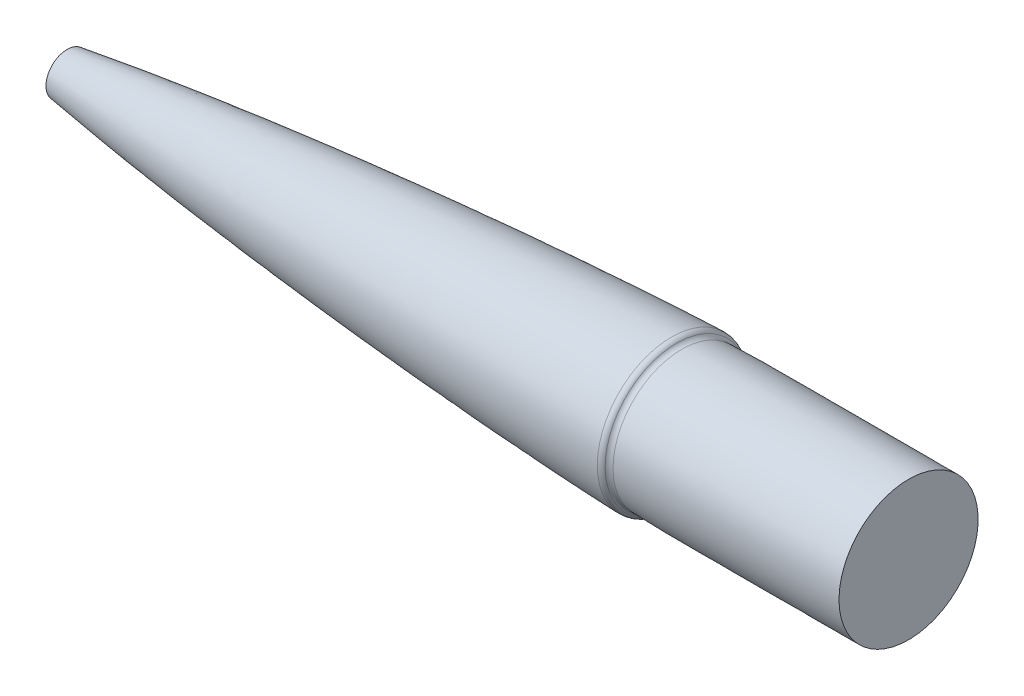
ISO-10303-21;
HEADER;
FILE_DESCRIPTION(('STEP AP214'),'2;1');
FILE_NAME('part.step','',(''),(''),'','','');
FILE_SCHEMA(('AUTOMOTIVE_DESIGN { 1 0 10303 214 1 1 1 1 }'));
ENDSEC;
DATA;
#1=APPLICATION_CONTEXT('core data for automotive mechanical design processes');
#2=APPLICATION_PROTOCOL_DEFINITION('international standard','automotive_design',2000,#1);
#3=PRODUCT_CONTEXT('',#1,'mechanical');
#4=PRODUCT('Part','Part','',(#3));
#5=PRODUCT_RELATED_PRODUCT_CATEGORY('part','',(#4));
#6=PRODUCT_DEFINITION_FORMATION('','',#4);
#7=PRODUCT_DEFINITION_CONTEXT('part definition',#1,'design');
#8=PRODUCT_DEFINITION('design','',#6,#7);
#9=PRODUCT_DEFINITION_SHAPE('','',#8);
#10=(LENGTH_UNIT() NAMED_UNIT(*) SI_UNIT(.MILLI.,.METRE.));
#11=(NAMED_UNIT(*) PLANE_ANGLE_UNIT() SI_UNIT($,.RADIAN.));
#12=(NAMED_UNIT(*) SI_UNIT($,.STERADIAN.) SOLID_ANGLE_UNIT());
#13=UNCERTAINTY_MEASURE_WITH_UNIT(LENGTH_MEASURE(1.E-05),#10,'distance_accuracy_value','');
#14=(GEOMETRIC_REPRESENTATION_CONTEXT(3) GLOBAL_UNCERTAINTY_ASSIGNED_CONTEXT((#13)) GLOBAL_UNIT_ASSIGNED_CONTEXT((#10,
#11,#12)) REPRESENTATION_CONTEXT('',''));
#15=CARTESIAN_POINT('',(0.,0.,0.));
#16=DIRECTION('',(0.,0.,1.));
#17=DIRECTION('',(1.,0.,0.));
#18=AXIS2_PLACEMENT_3D('',#15,#16,#17);
#19=CARTESIAN_POINT('',(4.83268455642582,0.,6.60552318193741));
#20=CARTESIAN_POINT('',(4.83749972097028,0.,6.60285947370063));
#21=CARTESIAN_POINT('',(4.82681383787675,0.,6.60876016188589));
#22=CARTESIAN_POINT('',(4.83801886693308,0.,6.60257668329158));
#23=CARTESIAN_POINT('',(4.83250618312896,0.,6.60561165797518));
#24=CARTESIAN_POINT('',(4.8399846110203,0.,6.60150461279268));
#25=CARTESIAN_POINT('',(4.83520410508804,0.,6.60412357297985));
#26=CARTESIAN_POINT('',(4.8464347391894,0.,6.59798672188499));
#27=CARTESIAN_POINT('',(4.83896554863311,0.,6.60204769683206));
#28=CARTESIAN_POINT('',(4.8539759734831,0.,6.59393191213478));
#29=CARTESIAN_POINT('',(4.84911899118824,0.,6.59654394521379));
#30=CARTESIAN_POINT('',(4.8641679427654,0.,6.58849982488547));
#31=CARTESIAN_POINT('',(4.86170750840961,0.,6.58980766712842));
#32=CARTESIAN_POINT('',(4.87679746030247,0.,6.58184072497347));
#33=CARTESIAN_POINT('',(4.87651514125029,0.,6.58198934907074));
#34=CARTESIAN_POINT('',(4.89921559976168,0.,6.57016388848399));
#35=CARTESIAN_POINT('',(4.90432341538071,0.,6.56755835116335));
#36=CARTESIAN_POINT('',(4.93475704207706,0.,6.55211459424268));
#37=CARTESIAN_POINT('',(4.94623689867739,0.,6.54635949091499));
#38=CARTESIAN_POINT('',(4.97679775161726,0.,6.53116904887707));
#39=CARTESIAN_POINT('',(4.99342554287252,0.,6.52298709115691));
#40=CARTESIAN_POINT('',(5.02409890874871,0.,6.50802514317069));
#41=CARTESIAN_POINT('',(5.044659359757,0.,6.49809059549946));
#42=CARTESIAN_POINT('',(5.07544018073853,0.,6.48335097808854));
#43=CARTESIAN_POINT('',(5.09885600542887,0.,6.47223965954034));
#44=CARTESIAN_POINT('',(5.12973367847781,0.,6.45770402853244));
#45=CARTESIAN_POINT('',(5.15537548823818,0.,6.44572972430582));
#46=CARTESIAN_POINT('',(5.18633782369174,0.,6.43137531575032));
#47=CARTESIAN_POINT('',(5.21368121334199,0.,6.41879007529082));
#48=CARTESIAN_POINT('',(5.2447189993178,0.,6.40459954663838));
#49=CARTESIAN_POINT('',(5.27324287392851,0.,6.39164454267426));
#50=CARTESIAN_POINT('',(5.30434899961548,0.,6.37760444985172));
#51=CARTESIAN_POINT('',(5.33354110646858,0.,6.36450914158684));
#52=CARTESIAN_POINT('',(5.36470997323617,0.,6.35060888956967));
#53=CARTESIAN_POINT('',(5.39407170494003,0.,6.33759006005425));
#54=CARTESIAN_POINT('',(5.42529881638663,0.,6.32382115405486));
#55=CARTESIAN_POINT('',(5.45434932394373,0.,6.31108198351092));
#56=CARTESIAN_POINT('',(5.4856309908471,0.,6.29743747628402));
#57=CARTESIAN_POINT('',(5.51391283997896,0.,6.28516624393363));
#58=CARTESIAN_POINT('',(5.54524547882567,0.,6.27163919678282));
#59=CARTESIAN_POINT('',(5.57247956278986,0.,6.25993673000104));
#60=CARTESIAN_POINT('',(5.60385711349994,0.,6.24651419025795));
#61=CARTESIAN_POINT('',(5.62995741615585,0.,6.23539740715504));
#62=CARTESIAN_POINT('',(5.66137589888544,0.,6.22207095959049));
#63=CARTESIAN_POINT('',(5.68627456092169,0.,6.21155229874281));
#64=CARTESIAN_POINT('',(5.71773058102512,0.,6.19831469847049));
#65=CARTESIAN_POINT('',(5.74138407559505,0.,6.18839781700479));
#66=CARTESIAN_POINT('',(5.77287471729874,0.,6.17524278957005));
#67=CARTESIAN_POINT('',(5.79526099537225,0.,6.16592377046405));
#68=CARTESIAN_POINT('',(5.84254511111652,0.,6.14630689667781));
#69=CARTESIAN_POINT('',(5.88352104666606,0.,6.129417198479));
#70=CARTESIAN_POINT('',(5.94668237522017,0.,6.10354235312387));
#71=CARTESIAN_POINT('',(5.98275550140594,0.,6.08885040636339));
#72=CARTESIAN_POINT('',(6.04601925522565,0.,6.0632270088621));
#73=CARTESIAN_POINT('',(6.07756403840755,0.,6.05051854445484));
#74=CARTESIAN_POINT('',(6.14091959540364,0.,6.02512298491023));
#75=CARTESIAN_POINT('',(6.16860262808675,0.,6.01408022182471));
#76=CARTESIAN_POINT('',(6.23204044160335,0.,5.98889084185814));
#77=CARTESIAN_POINT('',(6.25663256825075,0.,5.9791696817537));
#78=CARTESIAN_POINT('',(6.32014522146024,0.,5.9541696031706));
#79=CARTESIAN_POINT('',(6.34245362414577,0.,5.94542518684871));
#80=CARTESIAN_POINT('',(6.40603523176033,0.,5.92060100065827));
#81=CARTESIAN_POINT('',(6.42692097790816,0.,5.91247878693595));
#82=CARTESIAN_POINT('',(6.49056694962166,0.,5.88782009006219));
#83=CARTESIAN_POINT('',(6.51093672045816,0.,5.87995795236834));
#84=CARTESIAN_POINT('',(6.57464357246575,0.,5.85545697169104));
#85=CARTESIAN_POINT('',(6.59544319499273,0.,5.84748694072378));
#86=CARTESIAN_POINT('',(6.65920839624904,0.,5.82313822092973));
#87=CARTESIAN_POINT('',(6.6814162495825,0.,5.81468870758096));
#88=CARTESIAN_POINT('',(6.74523798919747,0.,5.79048857123038));
#89=CARTESIAN_POINT('',(6.76951825878803,0.,5.78131417164714));
#90=CARTESIAN_POINT('',(6.83339493947841,0.,5.75725942760681));
#91=CARTESIAN_POINT('',(6.8596734214108,0.,5.74739783947368));
#92=CARTESIAN_POINT('',(6.95556932930949,0.,5.71153125051222));
#93=CARTESIAN_POINT('',(7.01340753174464,0.,5.69004886411442));
#94=CARTESIAN_POINT('',(7.1414775821322,0.,5.6427888770091));
#95=CARTESIAN_POINT('',(7.20510392805037,0.,5.6194676051386));
#96=CARTESIAN_POINT('',(7.33337270115734,0.,5.57274966390496));
#97=CARTESIAN_POINT('',(7.4012029669081,0.,5.54820463008454));
#98=CARTESIAN_POINT('',(7.59388780681527,0.,5.47890598730019));
#99=CARTESIAN_POINT('',(7.73543883749296,0.,5.42862731186892));
#100=CARTESIAN_POINT('',(7.99303402975234,0.,5.33814806742735));
#101=CARTESIAN_POINT('',(8.13136793124169,0.,5.29009625338913));
#102=CARTESIAN_POINT('',(8.38955131631159,0.,5.20130933755284));
#103=CARTESIAN_POINT('',(8.52061198204528,0.,5.15668382125682));
#104=CARTESIAN_POINT('',(8.90865202682184,0.,5.02574902321967));
#105=CARTESIAN_POINT('',(9.16165698677185,0.,4.94190576947565));
#106=CARTESIAN_POINT('',(9.94029019567608,0.,4.687728042795));
#107=CARTESIAN_POINT('',(10.4608949378079,0.,4.52278983098063));
#108=CARTESIAN_POINT('',(13.0694093427846,0.,3.71666932260896));
#109=CARTESIAN_POINT('',(15.1730596457674,0.,3.12787826699114));
#110=CARTESIAN_POINT('',(21.5041419916135,0.,1.43865959019151));
#111=CARTESIAN_POINT('',(25.7532051724552,0.,0.421026181929159));
#112=CARTESIAN_POINT('',(34.2726824192563,0.,-1.51528134352232));
#113=CARTESIAN_POINT('',(38.5448966370535,0.,-2.42798670810905));
#114=CARTESIAN_POINT('',(47.1027601183387,0.,-4.18689319441429));
#115=CARTESIAN_POINT('',(51.3889242671881,0.,-5.0309718203088));
#116=CARTESIAN_POINT('',(64.2617852835467,0.,-7.48733150188042));
#117=CARTESIAN_POINT('',(72.8629142375998,0.,-9.02313024476923));
#118=CARTESIAN_POINT('',(90.0864300781289,0.,-11.9682312037464));
#119=CARTESIAN_POINT('',(98.7095200342393,0.,-13.3741187408272));
#120=CARTESIAN_POINT('',(124.601188031838,0.,-17.4482496701259));
#121=CARTESIAN_POINT('',(141.891817456551,0.,-19.9748151700434));
#122=CARTESIAN_POINT('',(176.507305156509,0.,-24.7769481923739));
#123=CARTESIAN_POINT('',(193.832729026664,0.,-27.049800159208));
#124=CARTESIAN_POINT('',(245.845180778652,0.,-33.5776574535152));
#125=CARTESIAN_POINT('',(280.56798660515,0.,-37.5442567701871));
#126=CARTESIAN_POINT('',(350.07183031062,0.,-44.9189154908417));
#127=CARTESIAN_POINT('',(384.853733718803,0.,-48.3222362982757));
#128=CARTESIAN_POINT('',(454.461735096074,0.,-54.6385663515796));
#129=CARTESIAN_POINT('',(489.288073765698,0.,-57.5503387899058));
#130=CARTESIAN_POINT('',(558.97765835012,0.,-62.8918443390221));
#131=CARTESIAN_POINT('',(593.840989824159,0.,-65.321984906555));
#132=CARTESIAN_POINT('',(663.601030955245,0.,-69.6470909711167));
#133=CARTESIAN_POINT('',(698.49775323348,0.,-71.5473308312863));
#134=CARTESIAN_POINT('',(750.867293771161,0.,-73.858019468879));
#135=CARTESIAN_POINT('',(768.327894946954,0.,-74.5383123540745));
#136=CARTESIAN_POINT('',(786.330846217041,0.,-75.1061683142761));
#137=CARTESIAN_POINT('',(786.868989785362,0.,-75.1230203611017));
#138=CARTESIAN_POINT('',(787.407137336109,0.,-75.1397468610843));
#139=CARTESIAN_POINT('',(789.769222398439,0.,-75.2131643015221));
#140=CARTESIAN_POINT('',(794.493542884528,0.,-75.3551615513797));
#141=CARTESIAN_POINT('',(801.580357780933,0.,-75.5584829979889));
#142=CARTESIAN_POINT('',(806.30534090121,0.,-75.6762894582134));
#143=CARTESIAN_POINT('',(808.667832461347,0.,-75.7351926883257));
#144=CARTESIAN_POINT('',(812.810288023743,0.,-75.8384751792936));
#145=CARTESIAN_POINT('',(821.095199148533,0.,-76.0450401612293));
#146=CARTESIAN_POINT('',(833.527393301713,0.,-76.2));
#147=CARTESIAN_POINT('',(841.814879135031,0.,-76.2));
#148=CARTESIAN_POINT('',(845.95862205169,0.,-76.2));
#149=CARTESIAN_POINT('',(850.74099737928,0.,-76.2));
#150=CARTESIAN_POINT('',(860.30574803446,0.,-76.2));
#151=CARTESIAN_POINT('',(874.65287401723,0.,-76.2));
#152=CARTESIAN_POINT('',(884.21762467241,0.,-76.2));
#153=CARTESIAN_POINT('',(889.,0.,-76.2));
#154=CARTESIAN_POINT('',(939.8,0.,-76.2));
#155=CARTESIAN_POINT('',(990.6,0.,-76.2));
#156=CARTESIAN_POINT('',(1041.4,0.,-76.2));
#157=B_SPLINE_CURVE_WITH_KNOTS('',3,(#19,#20,#21,#22,#23,#24,#25,#26,#27,#28,#29,#30,#31,#32,
#33,#34,#35,#36,#37,#38,#39,#40,#41,#42,#43,#44,#45,#46,#47,#48,#49,#50,#51,#52,#53,#54,#55,#56,
#57,#58,#59,#60,#61,#62,#63,#64,#65,#66,#67,#68,#69,#70,#71,#72,#73,#74,#75,#76,#77,#78,#79,#80,
#81,#82,#83,#84,#85,#86,#87,#88,#89,#90,#91,#92,#93,#94,#95,#96,#97,#98,#99,#100,#101,#102,#103,
#104,#105,#106,#107,#108,#109,#110,#111,#112,#113,#114,#115,#116,#117,#118,#119,#120,#121,#122,
#123,#124,#125,#126,#127,#128,#129,#130,#131,#132,#133,#134,#135,#136,#137,#138,#139,#140,#141,
#142,#143,#144,#145,#146,#147,#148,#149,#150,#151,#152,#153,#154,#155,#156),.UNSPECIFIED.,.F.,
.F.,(4,2,2,2,2,2,2,2,2,2,2,2,2,2,2,2,2,2,2,2,2,2,2,2,2,2,2,2,2,2,2,2,2,2,2,2,2,2,2,2,2,2,2,2,2,
2,2,2,2,2,2,2,2,2,2,2,2,2,2,3,1,1,3,1,1,3,1,1,3,4),(0.,2.45659755341227E-05,
3.68489633011841E-05,4.91319510682454E-05,7.36979266023682E-05,9.82639021364909E-05,
0.000122829877670614,0.000147395853204736,0.000196527804272982,0.000245659755341227,
0.000294791706409473,0.000343923657477718,0.000393055608545963,0.000442187559614209,
0.000491319510682454,0.0005404514617507,0.000589583412818945,0.000638715363887191,
0.000687847314955436,0.000736979266023681,0.000786111217091927,0.000835243168160172,
0.000884375119228418,0.000933507070296663,0.000982639021364909,0.0010809029235014,
0.00117916682563789,0.00127743072777438,0.00137569462991087,0.00147395853204736,
0.00157222243418385,0.00167048633632034,0.00176875023845684,0.00186701414059333,
0.00196527804272982,0.00206354194486631,0.0021618058470028,0.00235833365127578,
0.00255486145554876,0.00275138925982174,0.00314444486836771,0.00353750047691367,
0.00393055608545964,0.00471666730255156,0.00628888973673541,0.0125777794734708,
0.0251555589469417,0.0377333384204125,0.0503111178938833,0.075466676840825,0.100622235787767,
0.15093335368165,0.201244471575533,0.3018667073633,0.402488943151067,0.503111178938833,
0.6037334147266,0.704355650514367,0.75466676840825,0.756216994376473,0.763021383986146,
0.769825773595819,0.776630163205491,0.788561160997351,0.80049215878921,0.812423156581069,
0.826192956161041,0.839962755741013,0.853732555320985,1.),.UNSPECIFIED.);
#158=CARTESIAN_POINT('',(0.,0.,0.));
#159=DIRECTION('',(-1.,0.,0.));
#160=AXIS1_PLACEMENT('',#158,#159);
#161=SURFACE_OF_REVOLUTION('',#157,#160);
#162=CARTESIAN_POINT('',(1041.4,0.,0.));
#163=DIRECTION('',(-1.,0.,0.));
#164=DIRECTION('',(0.,0.,1.));
#165=AXIS2_PLACEMENT_3D('',#162,#163,#164);
#166=CIRCLE('',#165,76.2);
#167=CARTESIAN_POINT('',(1041.4,0.,76.2));
#168=VERTEX_POINT('',#167);
#169=EDGE_CURVE('E67',#168,#168,#166,.T.);
#170=ORIENTED_EDGE('',*,*,#169,.T.);
#171=EDGE_LOOP('',(#170));
#172=FACE_BOUND('',#171,.T.);
#173=CARTESIAN_POINT('',(792.986262238477,0.,0.));
#174=DIRECTION('',(-1.,0.,0.));
#175=DIRECTION('',(0.,0.,1.));
#176=AXIS2_PLACEMENT_3D('',#173,#174,#175);
#177=CIRCLE('',#176,75.3090467793957);
#178=CARTESIAN_POINT('',(792.986262238477,0.,75.3090467793957));
#179=VERTEX_POINT('',#178);
#180=EDGE_CURVE('E12',#179,#179,#177,.T.);
#181=ORIENTED_EDGE('',*,*,#180,.F.);
#182=EDGE_LOOP('',(#181));
#183=FACE_BOUND('',#182,.T.);
#184=ADVANCED_FACE('F47',(#172,#183),#161,.F.);
#185=CARTESIAN_POINT('',(792.797880449279,0.,0.));
#186=DIRECTION('',(-1.,0.,0.));
#187=DIRECTION('',(0.,0.,1.));
#188=AXIS2_PLACEMENT_3D('',#185,#186,#187);
#189=TOROIDAL_SURFACE('',#188,81.6562518573414,6.35000000000001);
#190=CARTESIAN_POINT('',(787.4,0.,0.));
#191=DIRECTION('',(-1.,0.,0.));
#192=DIRECTION('',(0.,0.,1.));
#193=AXIS2_PLACEMENT_3D('',#190,#191,#192);
#194=CIRCLE('',#193,78.3117957497969);
#195=CARTESIAN_POINT('',(787.4,0.,78.3117957497969));
#196=VERTEX_POINT('',#195);
#197=EDGE_CURVE('E54',#196,#196,#194,.T.);
#198=ORIENTED_EDGE('',*,*,#197,.F.);
#199=EDGE_LOOP('',(#198));
#200=FACE_BOUND('',#199,.T.);
#201=ORIENTED_EDGE('',*,*,#180,.T.);
#202=EDGE_LOOP('',(#201));
#203=FACE_BOUND('',#202,.T.);
#204=ADVANCED_FACE('F89',(#200,#203),#189,.F.);
#205=CARTESIAN_POINT('',(782.002119550721,0.,0.));
#206=DIRECTION('',(-1.,0.,0.));
#207=DIRECTION('',(0.,0.,1.));
#208=AXIS2_PLACEMENT_3D('',#205,#206,#207);
#209=TOROIDAL_SURFACE('',#208,74.9673396422523,6.35000000000003);
#210=ORIENTED_EDGE('',*,*,#197,.T.);
#211=EDGE_LOOP('',(#210));
#212=FACE_BOUND('',#211,.T.);
#213=CARTESIAN_POINT('',(781.794817917907,0.,0.));
#214=DIRECTION('',(-1.,0.,0.));
#215=DIRECTION('',(0.,0.,1.));
#216=AXIS2_PLACEMENT_3D('',#213,#214,#215);
#217=CIRCLE('',#216,81.3139549632744);
#218=CARTESIAN_POINT('',(781.794817917907,0.,81.3139549632744));
#219=VERTEX_POINT('',#218);
#220=EDGE_CURVE('E58',#219,#219,#217,.T.);
#221=ORIENTED_EDGE('',*,*,#220,.F.);
#222=EDGE_LOOP('',(#221));
#223=FACE_BOUND('',#222,.T.);
#224=ADVANCED_FACE('F85',(#212,#223),#209,.T.);
#225=CARTESIAN_POINT('',(1.45244842624921,0.,1.23264697666696));
#226=CARTESIAN_POINT('',(1.52882645439852,0.,1.18155010634796));
#227=CARTESIAN_POINT('',(1.67309054241462,0.,1.09479404995592));
#228=CARTESIAN_POINT('',(2.07893103489429,0.,0.875013099928082));
#229=CARTESIAN_POINT('',(2.62828038979555,0.,0.613724478137329));
#230=CARTESIAN_POINT('',(3.29019119701565,0.,0.32753611217494));
#231=CARTESIAN_POINT('',(3.84927139704919,0.,0.101471997255759));
#232=CARTESIAN_POINT('',(4.58305576925838,0.,-0.183876692202146));
#233=CARTESIAN_POINT('',(5.62531865421944,0.,-0.566314390544476));
#234=CARTESIAN_POINT('',(7.57361675674083,0.,-1.23102021959136));
#235=CARTESIAN_POINT('',(10.1540882156573,0.,-2.03601613698555));
#236=CARTESIAN_POINT('',(14.3306902511786,0.,-3.23639031913265));
#237=CARTESIAN_POINT('',(19.606120623133,0.,-4.61635813418839));
#238=CARTESIAN_POINT('',(25.9823729240471,0.,-6.15158658413236));
#239=CARTESIAN_POINT('',(32.3864369799119,0.,-7.59611973859471));
#240=CARTESIAN_POINT('',(40.9537795060795,0.,-9.42837869282166));
#241=CARTESIAN_POINT('',(51.6994376349832,0.,-11.5795806755008));
#242=CARTESIAN_POINT('',(64.632948511903,0.,-13.9971071100497));
#243=CARTESIAN_POINT('',(77.5936256929044,0.,-16.2896409179459));
#244=CARTESIAN_POINT('',(90.5746120795872,0.,-18.4783586125551));
#245=CARTESIAN_POINT('',(107.90513751837,0.,-21.2786328028619));
#246=CARTESIAN_POINT('',(129.601911643364,0.,-24.5916998906359));
#247=CARTESIAN_POINT('',(155.676122735182,0.,-28.3306648676024));
#248=CARTESIAN_POINT('',(181.780624308129,0.,-31.8710588851814));
#249=CARTESIAN_POINT('',(207.909316089286,0.,-35.2410998528516));
#250=CARTESIAN_POINT('',(234.058183470076,0.,-38.4608454567614));
#251=CARTESIAN_POINT('',(268.946365385981,0.,-42.572514826731));
#252=CARTESIAN_POINT('',(312.594336759653,0.,-47.4009379276722));
#253=CARTESIAN_POINT('',(365.019685973044,0.,-52.7606502047852));
#254=CARTESIAN_POINT('',(417.485255262941,0.,-57.7223011110558));
#255=CARTESIAN_POINT('',(469.985513157308,0.,-62.3083173520217));
#256=CARTESIAN_POINT('',(540.027082024871,0.,-67.9331237269786));
#257=CARTESIAN_POINT('',(610.124542731448,0.,-72.8280435060441));
#258=CARTESIAN_POINT('',(680.269983383821,0.,-76.9112446621285));
#259=CARTESIAN_POINT('',(724.129737671066,0.,-79.080505645521));
#260=CARTESIAN_POINT('',(759.227248844478,0.,-80.5377036730948));
#261=CARTESIAN_POINT('',(778.251825867424,0.,-81.2092800396818));
#262=CARTESIAN_POINT('',(788.500335390764,0.,-81.527068120762));
#263=CARTESIAN_POINT('',(789.97282713585,0.,-81.5717388323561));
#264=CARTESIAN_POINT('',(792.218857310202,0.,-81.6398762371904));
#265=CARTESIAN_POINT('',(796.711057091189,0.,-81.7715549058981));
#266=CARTESIAN_POINT('',(803.4496673757,0.,-81.9598813951358));
#267=CARTESIAN_POINT('',(807.942479666771,0.,-82.0685769210198));
#268=CARTESIAN_POINT('',(810.188885812307,0.,-82.1229246839617));
#269=CARTESIAN_POINT('',(814.111364387871,0.,-82.2178220097162));
#270=CARTESIAN_POINT('',(821.956321539,0.,-82.4076166612252));
#271=CARTESIAN_POINT('',(833.728061292409,0.,-82.5499940518676));
#272=CARTESIAN_POINT('',(841.575313978081,0.,-82.5499942766283));
#273=CARTESIAN_POINT('',(845.498940320917,0.,-82.5499943890087));
#274=CARTESIAN_POINT('',(850.050169175283,0.,-82.5499945193648));
#275=CARTESIAN_POINT('',(859.152626884014,0.,-82.549994780077));
#276=CARTESIAN_POINT('',(872.80631344711,0.,-82.5499951711454));
#277=CARTESIAN_POINT('',(881.908771155841,0.,-82.5499954318577));
#278=CARTESIAN_POINT('',(886.460000010207,0.,-82.5499955622138));
#279=CARTESIAN_POINT('',(938.106666673471,0.,-82.5499970414757));
#280=CARTESIAN_POINT('',(989.753333336736,0.,-82.5499985207376));
#281=CARTESIAN_POINT('',(1041.4,0.,-82.5499999999996));
#282=B_SPLINE_CURVE_WITH_KNOTS('',3,(#225,#226,#227,#228,#229,#230,#231,#232,#233,#234,#235,
#236,#237,#238,#239,#240,#241,#242,#243,#244,#245,#246,#247,#248,#249,#250,#251,#252,#253,#254,
#255,#256,#257,#258,#259,#260,#261,#262,#263,#264,#265,#266,#267,#268,#269,#270,#271,#272,#273,
#274,#275,#276,#277,#278,#279,#280,#281),.UNSPECIFIED.,.F.,.F.,(4,1,1,1,1,1,1,1,1,1,1,1,1,1,1,1,
1,1,1,1,1,1,1,1,1,1,1,1,1,1,1,1,1,1,1,1,3,1,1,3,1,1,3,1,1,3,4),(0.,0.000393442933372629,
0.000786885866745257,0.00157377173349051,0.00236065760023577,0.00300430995788763,
0.00339775289126026,0.00472131520047154,0.00629508693396205,0.00944263040094308,
0.0125901738679241,0.0188852608018862,0.0251803477358482,0.0314754346698103,0.0377705216037723,
0.0503606954716964,0.0629508693396205,0.0755410432075447,0.0881312170754688,0.100721390943393,
0.125901738679241,0.151082086415089,0.176262434150938,0.201442781886786,0.226623129622634,
0.251803477358482,0.302164172830179,0.352524868301875,0.402885563773571,0.453246259245268,
0.503606954716964,0.604328345660357,0.654689041132054,0.70504973660375,0.730230084339598,
0.755410432075447,0.759635317002295,0.766079644490401,0.772523971978508,0.778968299466614,
0.790220822326853,0.801473345187091,0.81272586804733,0.825778284931886,0.838830701816443,
0.851883118700999,1.),.UNSPECIFIED.);
#283=CARTESIAN_POINT('',(0.,0.,0.));
#284=DIRECTION('',(-1.,0.,0.));
#285=AXIS1_PLACEMENT('',#283,#284);
#286=SURFACE_OF_REVOLUTION('',#282,#285);
#287=ORIENTED_EDGE('',*,*,#220,.T.);
#288=EDGE_LOOP('',(#287));
#289=FACE_BOUND('',#288,.T.);
#290=CARTESIAN_POINT('',(119.6848,0.,0.));
#291=DIRECTION('',(-1.,0.,0.));
#292=DIRECTION('',(0.,0.,1.));
#293=AXIS2_PLACEMENT_3D('',#290,#291,#292);
#294=CIRCLE('',#293,23.0649453809158);
#295=CARTESIAN_POINT('',(119.6848,0.,23.0649453809158));
#296=VERTEX_POINT('',#295);
#297=EDGE_CURVE('E62',#296,#296,#294,.T.);
#298=ORIENTED_EDGE('',*,*,#297,.F.);
#299=EDGE_LOOP('',(#298));
#300=FACE_BOUND('',#299,.T.);
#301=ADVANCED_FACE('F80',(#289,#300),#286,.F.);
#302=CARTESIAN_POINT('',(119.6848,0.,0.));
#303=DIRECTION('',(1.,0.,0.));
#304=DIRECTION('',(0.,0.,-1.));
#305=AXIS2_PLACEMENT_3D('',#302,#303,#304);
#306=PLANE('',#305);
#307=ORIENTED_EDGE('',*,*,#297,.T.);
#308=EDGE_LOOP('',(#307));
#309=FACE_BOUND('',#308,.T.);
#310=ADVANCED_FACE('F84',(#309),#306,.F.);
#311=CARTESIAN_POINT('',(1041.4,0.,0.));
#312=DIRECTION('',(-1.,0.,0.));
#313=DIRECTION('',(0.,0.,1.));
#314=AXIS2_PLACEMENT_3D('',#311,#312,#313);
#315=PLANE('',#314);
#316=ORIENTED_EDGE('',*,*,#169,.F.);
#317=EDGE_LOOP('',(#316));
#318=FACE_BOUND('',#317,.T.);
#319=ADVANCED_FACE('F101',(#318),#315,.F.);
#320=CLOSED_SHELL('',(#184,#204,#224,#301,#310,#319));
#321=MANIFOLD_SOLID_BREP('B2',#320);
#322=ADVANCED_BREP_SHAPE_REPRESENTATION('',(#18,#321),#14);
#323=SHAPE_DEFINITION_REPRESENTATION(#9,#322);
ENDSEC;
END-ISO-10303-21;
